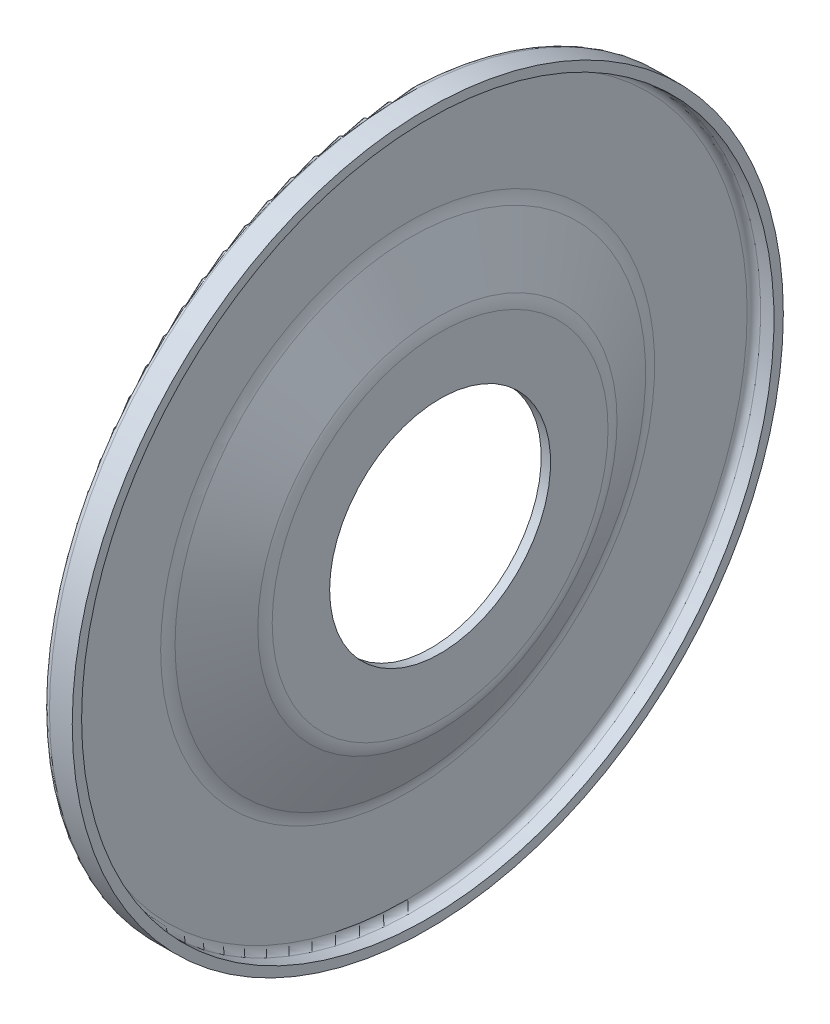
ISO-10303-21;
HEADER;
FILE_DESCRIPTION(('STEP AP214'),'2;1');
FILE_NAME('part.step','',(''),(''),'','','');
FILE_SCHEMA(('AUTOMOTIVE_DESIGN { 1 0 10303 214 1 1 1 1 }'));
ENDSEC;
DATA;
#1=APPLICATION_CONTEXT('core data for automotive mechanical design processes');
#2=APPLICATION_PROTOCOL_DEFINITION('international standard','automotive_design',2000,#1);
#3=PRODUCT_CONTEXT('',#1,'mechanical');
#4=PRODUCT('Part','Part','',(#3));
#5=PRODUCT_RELATED_PRODUCT_CATEGORY('part','',(#4));
#6=PRODUCT_DEFINITION_FORMATION('','',#4);
#7=PRODUCT_DEFINITION_CONTEXT('part definition',#1,'design');
#8=PRODUCT_DEFINITION('design','',#6,#7);
#9=PRODUCT_DEFINITION_SHAPE('','',#8);
#10=(LENGTH_UNIT() NAMED_UNIT(*) SI_UNIT(.MILLI.,.METRE.));
#11=(NAMED_UNIT(*) PLANE_ANGLE_UNIT() SI_UNIT($,.RADIAN.));
#12=(NAMED_UNIT(*) SI_UNIT($,.STERADIAN.) SOLID_ANGLE_UNIT());
#13=UNCERTAINTY_MEASURE_WITH_UNIT(LENGTH_MEASURE(1.E-05),#10,'distance_accuracy_value','');
#14=(GEOMETRIC_REPRESENTATION_CONTEXT(3) GLOBAL_UNCERTAINTY_ASSIGNED_CONTEXT((#13)) GLOBAL_UNIT_ASSIGNED_CONTEXT((#10,
#11,#12)) REPRESENTATION_CONTEXT('',''));
#15=CARTESIAN_POINT('',(0.,0.,0.));
#16=DIRECTION('',(0.,0.,1.));
#17=DIRECTION('',(1.,0.,0.));
#18=AXIS2_PLACEMENT_3D('',#15,#16,#17);
#19=CARTESIAN_POINT('',(0.,0.,0.));
#20=DIRECTION('',(-1.,0.,0.));
#21=DIRECTION('',(0.,0.,1.));
#22=AXIS2_PLACEMENT_3D('',#19,#20,#21);
#23=CYLINDRICAL_SURFACE('',#22,8.25);
#24=CARTESIAN_POINT('',(22.0430249501444,0.,0.));
#25=DIRECTION('',(-1.,0.,0.));
#26=DIRECTION('',(0.,0.,1.));
#27=AXIS2_PLACEMENT_3D('',#24,#25,#26);
#28=CIRCLE('',#27,8.25);
#29=CARTESIAN_POINT('',(22.0430249501444,0.,8.25));
#30=VERTEX_POINT('',#29);
#31=EDGE_CURVE('E11',#30,#30,#28,.T.);
#32=ORIENTED_EDGE('',*,*,#31,.F.);
#33=EDGE_LOOP('',(#32));
#34=FACE_BOUND('',#33,.T.);
#35=CARTESIAN_POINT('',(21.3430249501444,0.,0.));
#36=DIRECTION('',(-1.,0.,0.));
#37=DIRECTION('',(0.,0.,1.));
#38=AXIS2_PLACEMENT_3D('',#35,#36,#37);
#39=CIRCLE('',#38,8.25);
#40=CARTESIAN_POINT('',(21.3430249501444,0.,8.25));
#41=VERTEX_POINT('',#40);
#42=EDGE_CURVE('E150',#41,#41,#39,.T.);
#43=ORIENTED_EDGE('',*,*,#42,.T.);
#44=EDGE_LOOP('',(#43));
#45=FACE_BOUND('',#44,.T.);
#46=ADVANCED_FACE('F98',(#34,#45),#23,.F.);
#47=CARTESIAN_POINT('',(22.0430249501444,8.25,0.));
#48=DIRECTION('',(-1.,0.,0.));
#49=DIRECTION('',(0.,0.,1.));
#50=AXIS2_PLACEMENT_3D('',#47,#48,#49);
#51=PLANE('',#50);
#52=CARTESIAN_POINT('',(22.0430249501444,0.,0.));
#53=DIRECTION('',(-1.,0.,0.));
#54=DIRECTION('',(0.,0.,1.));
#55=AXIS2_PLACEMENT_3D('',#52,#53,#54);
#56=CIRCLE('',#55,12.5396882685227);
#57=CARTESIAN_POINT('',(22.0430249501444,0.,12.5396882685227));
#58=VERTEX_POINT('',#57);
#59=EDGE_CURVE('E104',#58,#58,#56,.T.);
#60=ORIENTED_EDGE('',*,*,#59,.F.);
#61=EDGE_LOOP('',(#60));
#62=FACE_BOUND('',#61,.T.);
#63=ORIENTED_EDGE('',*,*,#31,.T.);
#64=EDGE_LOOP('',(#63));
#65=FACE_BOUND('',#64,.T.);
#66=ADVANCED_FACE('F235',(#62,#65),#51,.F.);
#67=CARTESIAN_POINT('',(20.0430249501444,0.,0.));
#68=DIRECTION('',(-1.,0.,0.));
#69=DIRECTION('',(0.,0.,1.));
#70=AXIS2_PLACEMENT_3D('',#67,#68,#69);
#71=TOROIDAL_SURFACE('',#70,12.5396882685227,2.);
#72=CARTESIAN_POINT('',(21.841797428454,0.,0.));
#73=DIRECTION('',(-1.,0.,0.));
#74=DIRECTION('',(0.,0.,1.));
#75=AXIS2_PLACEMENT_3D('',#72,#73,#74);
#76=CIRCLE('',#75,13.4139980370122);
#77=CARTESIAN_POINT('',(21.841797428454,0.,13.4139980370122));
#78=VERTEX_POINT('',#77);
#79=EDGE_CURVE('E108',#78,#78,#76,.T.);
#80=ORIENTED_EDGE('',*,*,#79,.F.);
#81=EDGE_LOOP('',(#80));
#82=FACE_BOUND('',#81,.T.);
#83=ORIENTED_EDGE('',*,*,#59,.T.);
#84=EDGE_LOOP('',(#83));
#85=FACE_BOUND('',#84,.T.);
#86=ADVANCED_FACE('F230',(#82,#85),#71,.T.);
#87=CARTESIAN_POINT('',(21.841797428454,0.,0.));
#88=DIRECTION('',(-1.,0.,0.));
#89=DIRECTION('',(0.,0.,1.));
#90=AXIS2_PLACEMENT_3D('',#87,#88,#89);
#91=CONICAL_SURFACE('',#90,13.4139980370122,1.11836349148382);
#92=CARTESIAN_POINT('',(19.8211487618349,0.,0.));
#93=DIRECTION('',(-1.,0.,0.));
#94=DIRECTION('',(0.,0.,1.));
#95=AXIS2_PLACEMENT_3D('',#92,#93,#94);
#96=CIRCLE('',#95,17.5712056318985);
#97=CARTESIAN_POINT('',(19.8211487618349,0.,17.5712056318985));
#98=VERTEX_POINT('',#97);
#99=EDGE_CURVE('E112',#98,#98,#96,.T.);
#100=ORIENTED_EDGE('',*,*,#99,.F.);
#101=EDGE_LOOP('',(#100));
#102=FACE_BOUND('',#101,.T.);
#103=ORIENTED_EDGE('',*,*,#79,.T.);
#104=EDGE_LOOP('',(#103));
#105=FACE_BOUND('',#104,.T.);
#106=ADVANCED_FACE('F224',(#102,#105),#91,.T.);
#107=CARTESIAN_POINT('',(21.6199212401444,0.,0.));
#108=DIRECTION('',(-1.,0.,0.));
#109=DIRECTION('',(0.,0.,1.));
#110=AXIS2_PLACEMENT_3D('',#107,#108,#109);
#111=TOROIDAL_SURFACE('',#110,18.4455154003879,2.);
#112=CARTESIAN_POINT('',(19.6199212401444,0.,0.));
#113=DIRECTION('',(-1.,0.,0.));
#114=DIRECTION('',(0.,0.,1.));
#115=AXIS2_PLACEMENT_3D('',#112,#113,#114);
#116=CIRCLE('',#115,18.4455154003879);
#117=CARTESIAN_POINT('',(19.6199212401444,0.,18.4455154003879));
#118=VERTEX_POINT('',#117);
#119=EDGE_CURVE('E117',#118,#118,#116,.T.);
#120=ORIENTED_EDGE('',*,*,#119,.F.);
#121=EDGE_LOOP('',(#120));
#122=FACE_BOUND('',#121,.T.);
#123=ORIENTED_EDGE('',*,*,#99,.T.);
#124=EDGE_LOOP('',(#123));
#125=FACE_BOUND('',#124,.T.);
#126=ADVANCED_FACE('F218',(#122,#125),#111,.F.);
#127=CARTESIAN_POINT('',(19.6199212401444,18.4455154003879,0.));
#128=DIRECTION('',(-1.,0.,0.));
#129=DIRECTION('',(0.,0.,1.));
#130=AXIS2_PLACEMENT_3D('',#127,#128,#129);
#131=PLANE('',#130);
#132=CARTESIAN_POINT('',(19.6199212401444,0.,0.));
#133=DIRECTION('',(-1.,0.,0.));
#134=DIRECTION('',(0.,0.,1.));
#135=AXIS2_PLACEMENT_3D('',#132,#133,#134);
#136=CIRCLE('',#135,25.35108569);
#137=CARTESIAN_POINT('',(19.6199212401444,0.,25.35108569));
#138=VERTEX_POINT('',#137);
#139=EDGE_CURVE('E120',#138,#138,#136,.T.);
#140=ORIENTED_EDGE('',*,*,#139,.F.);
#141=EDGE_LOOP('',(#140));
#142=FACE_BOUND('',#141,.T.);
#143=ORIENTED_EDGE('',*,*,#119,.T.);
#144=EDGE_LOOP('',(#143));
#145=FACE_BOUND('',#144,.T.);
#146=ADVANCED_FACE('F212',(#142,#145),#131,.F.);
#147=CARTESIAN_POINT('',(20.1199212401444,0.,0.));
#148=DIRECTION('',(-1.,0.,0.));
#149=DIRECTION('',(0.,0.,1.));
#150=AXIS2_PLACEMENT_3D('',#147,#148,#149);
#151=TOROIDAL_SURFACE('',#150,25.35108569,0.5);
#152=CARTESIAN_POINT('',(20.1199212401444,0.,0.));
#153=DIRECTION('',(-1.,0.,0.));
#154=DIRECTION('',(0.,0.,1.));
#155=AXIS2_PLACEMENT_3D('',#152,#153,#154);
#156=CIRCLE('',#155,25.85108569);
#157=CARTESIAN_POINT('',(20.1199212401444,0.,25.85108569));
#158=VERTEX_POINT('',#157);
#159=EDGE_CURVE('E123',#158,#158,#156,.T.);
#160=ORIENTED_EDGE('',*,*,#159,.F.);
#161=EDGE_LOOP('',(#160));
#162=FACE_BOUND('',#161,.T.);
#163=ORIENTED_EDGE('',*,*,#139,.T.);
#164=EDGE_LOOP('',(#163));
#165=FACE_BOUND('',#164,.T.);
#166=ADVANCED_FACE('F206',(#162,#165),#151,.F.);
#167=CARTESIAN_POINT('',(0.,0.,0.));
#168=DIRECTION('',(-1.,0.,0.));
#169=DIRECTION('',(0.,0.,1.));
#170=AXIS2_PLACEMENT_3D('',#167,#168,#169);
#171=CYLINDRICAL_SURFACE('',#170,25.85108569);
#172=CARTESIAN_POINT('',(21.1226296701444,0.,0.));
#173=DIRECTION('',(-1.,0.,0.));
#174=DIRECTION('',(0.,0.,1.));
#175=AXIS2_PLACEMENT_3D('',#172,#173,#174);
#176=CIRCLE('',#175,25.85108569);
#177=CARTESIAN_POINT('',(21.1226296701444,0.,25.85108569));
#178=VERTEX_POINT('',#177);
#179=EDGE_CURVE('E126',#178,#178,#176,.T.);
#180=ORIENTED_EDGE('',*,*,#179,.F.);
#181=EDGE_LOOP('',(#180));
#182=FACE_BOUND('',#181,.T.);
#183=ORIENTED_EDGE('',*,*,#159,.T.);
#184=EDGE_LOOP('',(#183));
#185=FACE_BOUND('',#184,.T.);
#186=ADVANCED_FACE('F200',(#182,#185),#171,.F.);
#187=CARTESIAN_POINT('',(21.1226296701444,25.85108569,0.));
#188=DIRECTION('',(-1.,0.,0.));
#189=DIRECTION('',(0.,0.,1.));
#190=AXIS2_PLACEMENT_3D('',#187,#188,#189);
#191=PLANE('',#190);
#192=CARTESIAN_POINT('',(21.1226296701444,0.,0.));
#193=DIRECTION('',(-1.,0.,0.));
#194=DIRECTION('',(0.,0.,1.));
#195=AXIS2_PLACEMENT_3D('',#192,#193,#194);
#196=CIRCLE('',#195,26.55108569);
#197=CARTESIAN_POINT('',(21.1226296701444,0.,26.55108569));
#198=VERTEX_POINT('',#197);
#199=EDGE_CURVE('E129',#198,#198,#196,.T.);
#200=ORIENTED_EDGE('',*,*,#199,.F.);
#201=EDGE_LOOP('',(#200));
#202=FACE_BOUND('',#201,.T.);
#203=ORIENTED_EDGE('',*,*,#179,.T.);
#204=EDGE_LOOP('',(#203));
#205=FACE_BOUND('',#204,.T.);
#206=ADVANCED_FACE('F194',(#202,#205),#191,.F.);
#207=CARTESIAN_POINT('',(0.,0.,0.));
#208=DIRECTION('',(-1.,0.,0.));
#209=DIRECTION('',(0.,0.,1.));
#210=AXIS2_PLACEMENT_3D('',#207,#208,#209);
#211=CYLINDRICAL_SURFACE('',#210,26.55108569);
#212=CARTESIAN_POINT('',(19.4199212401444,0.,0.));
#213=DIRECTION('',(-1.,0.,0.));
#214=DIRECTION('',(0.,0.,1.));
#215=AXIS2_PLACEMENT_3D('',#212,#213,#214);
#216=CIRCLE('',#215,26.55108569);
#217=CARTESIAN_POINT('',(19.4199212401444,0.,26.55108569));
#218=VERTEX_POINT('',#217);
#219=EDGE_CURVE('E132',#218,#218,#216,.T.);
#220=ORIENTED_EDGE('',*,*,#219,.F.);
#221=EDGE_LOOP('',(#220));
#222=FACE_BOUND('',#221,.T.);
#223=ORIENTED_EDGE('',*,*,#199,.T.);
#224=EDGE_LOOP('',(#223));
#225=FACE_BOUND('',#224,.T.);
#226=ADVANCED_FACE('F188',(#222,#225),#211,.T.);
#227=CARTESIAN_POINT('',(19.4199212401444,0.,0.));
#228=DIRECTION('',(-1.,0.,0.));
#229=DIRECTION('',(0.,0.,1.));
#230=AXIS2_PLACEMENT_3D('',#227,#228,#229);
#231=TOROIDAL_SURFACE('',#230,26.05108569,0.5);
#232=CARTESIAN_POINT('',(18.9199212401444,0.,0.));
#233=DIRECTION('',(-1.,0.,0.));
#234=DIRECTION('',(0.,0.,1.));
#235=AXIS2_PLACEMENT_3D('',#232,#233,#234);
#236=CIRCLE('',#235,26.05108569);
#237=CARTESIAN_POINT('',(18.9199212401444,0.,26.05108569));
#238=VERTEX_POINT('',#237);
#239=EDGE_CURVE('E135',#238,#238,#236,.T.);
#240=ORIENTED_EDGE('',*,*,#239,.F.);
#241=EDGE_LOOP('',(#240));
#242=FACE_BOUND('',#241,.T.);
#243=ORIENTED_EDGE('',*,*,#219,.T.);
#244=EDGE_LOOP('',(#243));
#245=FACE_BOUND('',#244,.T.);
#246=ADVANCED_FACE('F182',(#242,#245),#231,.T.);
#247=CARTESIAN_POINT('',(18.9199212401444,18.2844062943708,0.));
#248=DIRECTION('',(1.,0.,0.));
#249=DIRECTION('',(0.,0.,-1.));
#250=AXIS2_PLACEMENT_3D('',#247,#248,#249);
#251=PLANE('',#250);
#252=CARTESIAN_POINT('',(18.9199212401444,0.,0.));
#253=DIRECTION('',(-1.,0.,0.));
#254=DIRECTION('',(0.,0.,1.));
#255=AXIS2_PLACEMENT_3D('',#252,#253,#254);
#256=CIRCLE('',#255,18.2844062943708);
#257=CARTESIAN_POINT('',(18.9199212401444,0.,18.2844062943708));
#258=VERTEX_POINT('',#257);
#259=EDGE_CURVE('E138',#258,#258,#256,.T.);
#260=ORIENTED_EDGE('',*,*,#259,.F.);
#261=EDGE_LOOP('',(#260));
#262=FACE_BOUND('',#261,.T.);
#263=ORIENTED_EDGE('',*,*,#239,.T.);
#264=EDGE_LOOP('',(#263));
#265=FACE_BOUND('',#264,.T.);
#266=ADVANCED_FACE('F176',(#262,#265),#251,.F.);
#267=CARTESIAN_POINT('',(20.9199212401444,0.,0.));
#268=DIRECTION('',(-1.,0.,0.));
#269=DIRECTION('',(0.,0.,1.));
#270=AXIS2_PLACEMENT_3D('',#267,#268,#269);
#271=TOROIDAL_SURFACE('',#270,18.2844062943708,2.);
#272=CARTESIAN_POINT('',(19.1211487618349,0.,0.));
#273=DIRECTION('',(-1.,0.,0.));
#274=DIRECTION('',(0.,0.,1.));
#275=AXIS2_PLACEMENT_3D('',#272,#273,#274);
#276=CIRCLE('',#275,17.4100965258814);
#277=CARTESIAN_POINT('',(19.1211487618349,0.,17.4100965258814));
#278=VERTEX_POINT('',#277);
#279=EDGE_CURVE('E141',#278,#278,#276,.T.);
#280=ORIENTED_EDGE('',*,*,#279,.F.);
#281=EDGE_LOOP('',(#280));
#282=FACE_BOUND('',#281,.T.);
#283=ORIENTED_EDGE('',*,*,#259,.T.);
#284=EDGE_LOOP('',(#283));
#285=FACE_BOUND('',#284,.T.);
#286=ADVANCED_FACE('F170',(#282,#285),#271,.T.);
#287=CARTESIAN_POINT('',(19.1211487618349,0.,0.));
#288=DIRECTION('',(-1.,0.,0.));
#289=DIRECTION('',(0.,0.,1.));
#290=AXIS2_PLACEMENT_3D('',#287,#288,#289);
#291=CONICAL_SURFACE('',#290,17.4100965258814,1.11836349148382);
#292=CARTESIAN_POINT('',(21.141797428454,0.,0.));
#293=DIRECTION('',(-1.,0.,0.));
#294=DIRECTION('',(0.,0.,1.));
#295=AXIS2_PLACEMENT_3D('',#292,#293,#294);
#296=CIRCLE('',#295,13.2528889309951);
#297=CARTESIAN_POINT('',(21.141797428454,0.,13.2528889309951));
#298=VERTEX_POINT('',#297);
#299=EDGE_CURVE('E144',#298,#298,#296,.T.);
#300=ORIENTED_EDGE('',*,*,#299,.F.);
#301=EDGE_LOOP('',(#300));
#302=FACE_BOUND('',#301,.T.);
#303=ORIENTED_EDGE('',*,*,#279,.T.);
#304=EDGE_LOOP('',(#303));
#305=FACE_BOUND('',#304,.T.);
#306=ADVANCED_FACE('F164',(#302,#305),#291,.F.);
#307=CARTESIAN_POINT('',(19.3430249501444,0.,0.));
#308=DIRECTION('',(-1.,0.,0.));
#309=DIRECTION('',(0.,0.,1.));
#310=AXIS2_PLACEMENT_3D('',#307,#308,#309);
#311=TOROIDAL_SURFACE('',#310,12.3785791625057,2.);
#312=CARTESIAN_POINT('',(21.3430249501444,0.,0.));
#313=DIRECTION('',(-1.,0.,0.));
#314=DIRECTION('',(0.,0.,1.));
#315=AXIS2_PLACEMENT_3D('',#312,#313,#314);
#316=CIRCLE('',#315,12.3785791625057);
#317=CARTESIAN_POINT('',(21.3430249501444,0.,12.3785791625057));
#318=VERTEX_POINT('',#317);
#319=EDGE_CURVE('E147',#318,#318,#316,.T.);
#320=ORIENTED_EDGE('',*,*,#319,.F.);
#321=EDGE_LOOP('',(#320));
#322=FACE_BOUND('',#321,.T.);
#323=ORIENTED_EDGE('',*,*,#299,.T.);
#324=EDGE_LOOP('',(#323));
#325=FACE_BOUND('',#324,.T.);
#326=ADVANCED_FACE('F158',(#322,#325),#311,.F.);
#327=CARTESIAN_POINT('',(21.3430249501444,8.25,0.));
#328=DIRECTION('',(1.,0.,0.));
#329=DIRECTION('',(0.,0.,-1.));
#330=AXIS2_PLACEMENT_3D('',#327,#328,#329);
#331=PLANE('',#330);
#332=ORIENTED_EDGE('',*,*,#42,.F.);
#333=EDGE_LOOP('',(#332));
#334=FACE_BOUND('',#333,.T.);
#335=ORIENTED_EDGE('',*,*,#319,.T.);
#336=EDGE_LOOP('',(#335));
#337=FACE_BOUND('',#336,.T.);
#338=ADVANCED_FACE('F155',(#334,#337),#331,.F.);
#339=CLOSED_SHELL('',(#46,#66,#86,#106,#126,#146,#166,#186,#206,#226,#246,#266,#286,#306,#326,#338));
#340=MANIFOLD_SOLID_BREP('B2',#339);
#341=ADVANCED_BREP_SHAPE_REPRESENTATION('',(#18,#340),#14);
#342=SHAPE_DEFINITION_REPRESENTATION(#9,#341);
ENDSEC;
END-ISO-10303-21;
